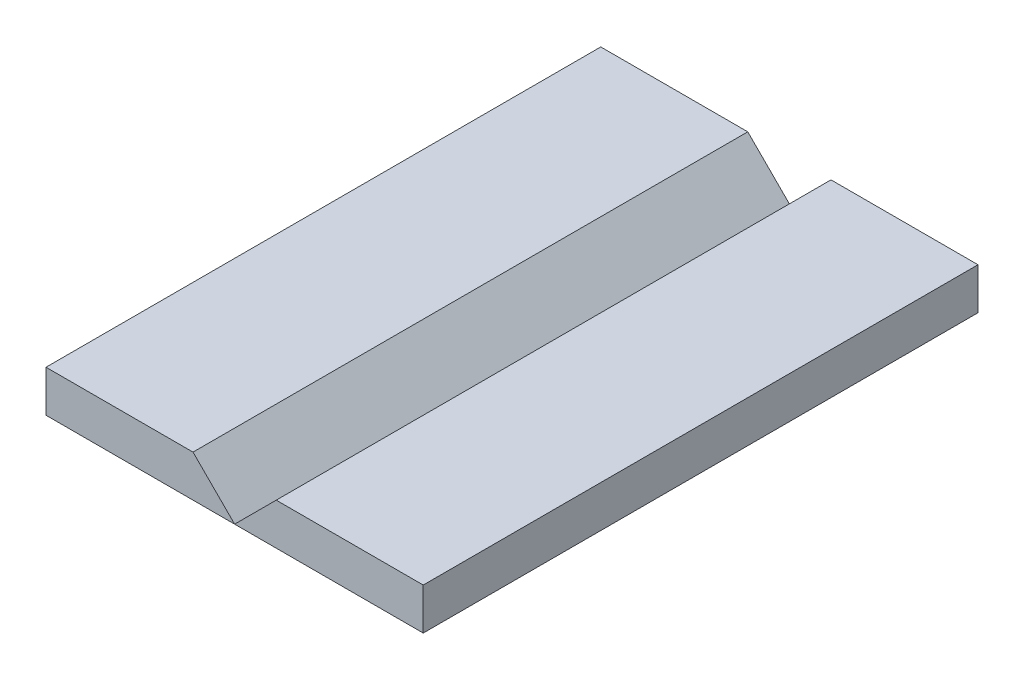
ISO-10303-21;
HEADER;
FILE_DESCRIPTION(('STEP AP214'),'2;1');
FILE_NAME('part.step','',(''),(''),'','','');
FILE_SCHEMA(('AUTOMOTIVE_DESIGN { 1 0 10303 214 1 1 1 1 }'));
ENDSEC;
DATA;
#1=APPLICATION_CONTEXT('core data for automotive mechanical design processes');
#2=APPLICATION_PROTOCOL_DEFINITION('international standard','automotive_design',2000,#1);
#3=PRODUCT_CONTEXT('',#1,'mechanical');
#4=PRODUCT('Part','Part','',(#3));
#5=PRODUCT_RELATED_PRODUCT_CATEGORY('part','',(#4));
#6=PRODUCT_DEFINITION_FORMATION('','',#4);
#7=PRODUCT_DEFINITION_CONTEXT('part definition',#1,'design');
#8=PRODUCT_DEFINITION('design','',#6,#7);
#9=PRODUCT_DEFINITION_SHAPE('','',#8);
#10=(LENGTH_UNIT() NAMED_UNIT(*) SI_UNIT(.MILLI.,.METRE.));
#11=(NAMED_UNIT(*) PLANE_ANGLE_UNIT() SI_UNIT($,.RADIAN.));
#12=(NAMED_UNIT(*) SI_UNIT($,.STERADIAN.) SOLID_ANGLE_UNIT());
#13=UNCERTAINTY_MEASURE_WITH_UNIT(LENGTH_MEASURE(1.E-05),#10,'distance_accuracy_value','');
#14=(GEOMETRIC_REPRESENTATION_CONTEXT(3) GLOBAL_UNCERTAINTY_ASSIGNED_CONTEXT((#13)) GLOBAL_UNIT_ASSIGNED_CONTEXT((#10,
#11,#12)) REPRESENTATION_CONTEXT('',''));
#15=CARTESIAN_POINT('',(0.,0.,0.));
#16=DIRECTION('',(0.,0.,1.));
#17=DIRECTION('',(1.,0.,0.));
#18=AXIS2_PLACEMENT_3D('',#15,#16,#17);
#19=CARTESIAN_POINT('',(34.,-34.,200.));
#20=DIRECTION('',(-0.707106781186548,0.707106781186548,0.));
#21=DIRECTION('',(-0.707106781186548,-0.707106781186548,0.));
#22=AXIS2_PLACEMENT_3D('',#19,#20,#21);
#23=PLANE('',#22);
#24=DIRECTION('',(0.707106781186548,0.707106781186548,0.));
#25=VECTOR('',#24,1.);
#26=CARTESIAN_POINT('',(34.,-34.,0.));
#27=LINE('',#26,#25);
#28=CARTESIAN_POINT('',(68.,0.,0.));
#29=VERTEX_POINT('',#28);
#30=CARTESIAN_POINT('',(83.0000000000004,15.0000000000004,0.));
#31=VERTEX_POINT('',#30);
#32=EDGE_CURVE('E133',#29,#31,#27,.T.);
#33=ORIENTED_EDGE('',*,*,#32,.F.);
#34=DIRECTION('',(0.,0.,-1.));
#35=VECTOR('',#34,1.);
#36=CARTESIAN_POINT('',(68.,0.,200.));
#37=LINE('',#36,#35);
#38=CARTESIAN_POINT('',(68.,0.,200.));
#39=VERTEX_POINT('',#38);
#40=EDGE_CURVE('E13',#39,#29,#37,.T.);
#41=ORIENTED_EDGE('',*,*,#40,.F.);
#42=DIRECTION('',(0.707106781186548,0.707106781186548,0.));
#43=VECTOR('',#42,1.);
#44=CARTESIAN_POINT('',(34.,-34.,200.));
#45=LINE('',#44,#43);
#46=CARTESIAN_POINT('',(83.0000000000004,15.0000000000004,200.));
#47=VERTEX_POINT('',#46);
#48=EDGE_CURVE('E121',#39,#47,#45,.T.);
#49=ORIENTED_EDGE('',*,*,#48,.T.);
#50=DIRECTION('',(0.,0.,-1.));
#51=VECTOR('',#50,1.);
#52=CARTESIAN_POINT('',(83.0000000000004,15.0000000000004,200.));
#53=LINE('',#52,#51);
#54=EDGE_CURVE('E110',#47,#31,#53,.T.);
#55=ORIENTED_EDGE('',*,*,#54,.T.);
#56=EDGE_LOOP('',(#33,#41,#49,#55));
#57=FACE_BOUND('',#56,.T.);
#58=ADVANCED_FACE('F71',(#57),#23,.T.);
#59=CARTESIAN_POINT('',(0.,0.,200.));
#60=DIRECTION('',(0.,1.,0.));
#61=DIRECTION('',(0.,0.,1.));
#62=AXIS2_PLACEMENT_3D('',#59,#60,#61);
#63=PLANE('',#62);
#64=DIRECTION('',(1.,0.,0.));
#65=VECTOR('',#64,1.);
#66=CARTESIAN_POINT('',(0.,0.,0.));
#67=LINE('',#66,#65);
#68=CARTESIAN_POINT('',(136.,0.,0.));
#69=VERTEX_POINT('',#68);
#70=EDGE_CURVE('E126',#29,#69,#67,.T.);
#71=ORIENTED_EDGE('',*,*,#70,.T.);
#72=DIRECTION('',(0.,0.,-1.));
#73=VECTOR('',#72,1.);
#74=CARTESIAN_POINT('',(136.,0.,200.));
#75=LINE('',#74,#73);
#76=CARTESIAN_POINT('',(136.,0.,200.));
#77=VERTEX_POINT('',#76);
#78=EDGE_CURVE('E79',#77,#69,#75,.T.);
#79=ORIENTED_EDGE('',*,*,#78,.F.);
#80=DIRECTION('',(1.,0.,0.));
#81=VECTOR('',#80,1.);
#82=CARTESIAN_POINT('',(0.,0.,200.));
#83=LINE('',#82,#81);
#84=EDGE_CURVE('E116',#39,#77,#83,.T.);
#85=ORIENTED_EDGE('',*,*,#84,.F.);
#86=ORIENTED_EDGE('',*,*,#40,.T.);
#87=EDGE_LOOP('',(#71,#79,#85,#86));
#88=FACE_BOUND('',#87,.T.);
#89=ADVANCED_FACE('F124',(#88),#63,.F.);
#90=CARTESIAN_POINT('',(136.,0.,200.));
#91=DIRECTION('',(-1.,0.,0.));
#92=DIRECTION('',(0.,0.,1.));
#93=AXIS2_PLACEMENT_3D('',#90,#91,#92);
#94=PLANE('',#93);
#95=DIRECTION('',(0.,1.,0.));
#96=VECTOR('',#95,1.);
#97=CARTESIAN_POINT('',(136.,0.,0.));
#98=LINE('',#97,#96);
#99=CARTESIAN_POINT('',(136.,15.0000000000004,0.));
#100=VERTEX_POINT('',#99);
#101=EDGE_CURVE('E103',#69,#100,#98,.T.);
#102=ORIENTED_EDGE('',*,*,#101,.T.);
#103=DIRECTION('',(0.,0.,-1.));
#104=VECTOR('',#103,1.);
#105=CARTESIAN_POINT('',(136.,15.0000000000004,200.));
#106=LINE('',#105,#104);
#107=CARTESIAN_POINT('',(136.,15.0000000000004,200.));
#108=VERTEX_POINT('',#107);
#109=EDGE_CURVE('E127',#108,#100,#106,.T.);
#110=ORIENTED_EDGE('',*,*,#109,.F.);
#111=DIRECTION('',(0.,1.,0.));
#112=VECTOR('',#111,1.);
#113=CARTESIAN_POINT('',(136.,0.,200.));
#114=LINE('',#113,#112);
#115=EDGE_CURVE('E120',#77,#108,#114,.T.);
#116=ORIENTED_EDGE('',*,*,#115,.F.);
#117=ORIENTED_EDGE('',*,*,#78,.T.);
#118=EDGE_LOOP('',(#102,#110,#116,#117));
#119=FACE_BOUND('',#118,.T.);
#120=ADVANCED_FACE('F128',(#119),#94,.F.);
#121=CARTESIAN_POINT('',(0.,15.0000000000004,200.));
#122=DIRECTION('',(0.,-1.,0.));
#123=DIRECTION('',(0.,0.,-1.));
#124=AXIS2_PLACEMENT_3D('',#121,#122,#123);
#125=PLANE('',#124);
#126=DIRECTION('',(-1.,0.,0.));
#127=VECTOR('',#126,1.);
#128=CARTESIAN_POINT('',(0.,15.0000000000004,0.));
#129=LINE('',#128,#127);
#130=EDGE_CURVE('E138',#100,#31,#129,.T.);
#131=ORIENTED_EDGE('',*,*,#130,.T.);
#132=ORIENTED_EDGE('',*,*,#54,.F.);
#133=DIRECTION('',(-1.,0.,0.));
#134=VECTOR('',#133,1.);
#135=CARTESIAN_POINT('',(0.,15.0000000000004,200.));
#136=LINE('',#135,#134);
#137=EDGE_CURVE('E87',#108,#47,#136,.T.);
#138=ORIENTED_EDGE('',*,*,#137,.F.);
#139=ORIENTED_EDGE('',*,*,#109,.T.);
#140=EDGE_LOOP('',(#131,#132,#138,#139));
#141=FACE_BOUND('',#140,.T.);
#142=ADVANCED_FACE('F143',(#141),#125,.F.);
#143=CARTESIAN_POINT('',(0.,0.,200.));
#144=DIRECTION('',(0.,0.,1.));
#145=DIRECTION('',(1.,0.,0.));
#146=AXIS2_PLACEMENT_3D('',#143,#144,#145);
#147=PLANE('',#146);
#148=ORIENTED_EDGE('',*,*,#48,.F.);
#149=ORIENTED_EDGE('',*,*,#84,.T.);
#150=ORIENTED_EDGE('',*,*,#115,.T.);
#151=ORIENTED_EDGE('',*,*,#137,.T.);
#152=EDGE_LOOP('',(#148,#149,#150,#151));
#153=FACE_BOUND('',#152,.T.);
#154=ADVANCED_FACE('F118',(#153),#147,.T.);
#155=CARTESIAN_POINT('',(0.,0.,0.));
#156=DIRECTION('',(0.,0.,1.));
#157=DIRECTION('',(1.,0.,0.));
#158=AXIS2_PLACEMENT_3D('',#155,#156,#157);
#159=PLANE('',#158);
#160=ORIENTED_EDGE('',*,*,#32,.T.);
#161=ORIENTED_EDGE('',*,*,#130,.F.);
#162=ORIENTED_EDGE('',*,*,#101,.F.);
#163=ORIENTED_EDGE('',*,*,#70,.F.);
#164=EDGE_LOOP('',(#160,#161,#162,#163));
#165=FACE_BOUND('',#164,.T.);
#166=ADVANCED_FACE('F145',(#165),#159,.F.);
#167=CLOSED_SHELL('',(#58,#89,#120,#142,#154,#166));
#168=MANIFOLD_SOLID_BREP('B2',#167);
#169=CARTESIAN_POINT('',(0.,0.,200.));
#170=DIRECTION('',(0.,1.,0.));
#171=DIRECTION('',(0.,0.,1.));
#172=AXIS2_PLACEMENT_3D('',#169,#170,#171);
#173=PLANE('',#172);
#174=DIRECTION('',(1.,0.,0.));
#175=VECTOR('',#174,1.);
#176=CARTESIAN_POINT('',(0.,0.,0.));
#177=LINE('',#176,#175);
#178=CARTESIAN_POINT('',(0.,0.,0.));
#179=VERTEX_POINT('',#178);
#180=CARTESIAN_POINT('',(68.,0.,0.));
#181=VERTEX_POINT('',#180);
#182=EDGE_CURVE('E258',#179,#181,#177,.T.);
#183=ORIENTED_EDGE('',*,*,#182,.T.);
#184=DIRECTION('',(0.,0.,-1.));
#185=VECTOR('',#184,1.);
#186=CARTESIAN_POINT('',(68.,0.,200.));
#187=LINE('',#186,#185);
#188=CARTESIAN_POINT('',(68.,0.,200.));
#189=VERTEX_POINT('',#188);
#190=EDGE_CURVE('E69',#189,#181,#187,.T.);
#191=ORIENTED_EDGE('',*,*,#190,.F.);
#192=DIRECTION('',(1.,0.,0.));
#193=VECTOR('',#192,1.);
#194=CARTESIAN_POINT('',(0.,0.,200.));
#195=LINE('',#194,#193);
#196=CARTESIAN_POINT('',(0.,0.,200.));
#197=VERTEX_POINT('',#196);
#198=EDGE_CURVE('E244',#197,#189,#195,.T.);
#199=ORIENTED_EDGE('',*,*,#198,.F.);
#200=DIRECTION('',(0.,0.,-1.));
#201=VECTOR('',#200,1.);
#202=CARTESIAN_POINT('',(0.,0.,200.));
#203=LINE('',#202,#201);
#204=EDGE_CURVE('E211',#197,#179,#203,.T.);
#205=ORIENTED_EDGE('',*,*,#204,.T.);
#206=EDGE_LOOP('',(#183,#191,#199,#205));
#207=FACE_BOUND('',#206,.T.);
#208=ADVANCED_FACE('F195',(#207),#173,.F.);
#209=CARTESIAN_POINT('',(34.,34.,200.));
#210=DIRECTION('',(-0.707106781186548,-0.707106781186548,0.));
#211=DIRECTION('',(0.707106781186548,-0.707106781186548,0.));
#212=AXIS2_PLACEMENT_3D('',#209,#210,#211);
#213=PLANE('',#212);
#214=DIRECTION('',(-0.707106781186548,0.707106781186548,0.));
#215=VECTOR('',#214,1.);
#216=CARTESIAN_POINT('',(34.,34.,0.));
#217=LINE('',#216,#215);
#218=CARTESIAN_POINT('',(52.9999999999996,15.0000000000004,0.));
#219=VERTEX_POINT('',#218);
#220=EDGE_CURVE('E249',#181,#219,#217,.T.);
#221=ORIENTED_EDGE('',*,*,#220,.T.);
#222=DIRECTION('',(0.,0.,-1.));
#223=VECTOR('',#222,1.);
#224=CARTESIAN_POINT('',(52.9999999999996,15.0000000000004,200.));
#225=LINE('',#224,#223);
#226=CARTESIAN_POINT('',(52.9999999999996,15.0000000000004,200.));
#227=VERTEX_POINT('',#226);
#228=EDGE_CURVE('E203',#227,#219,#225,.T.);
#229=ORIENTED_EDGE('',*,*,#228,.F.);
#230=DIRECTION('',(-0.707106781186548,0.707106781186548,0.));
#231=VECTOR('',#230,1.);
#232=CARTESIAN_POINT('',(34.,34.,200.));
#233=LINE('',#232,#231);
#234=EDGE_CURVE('E236',#189,#227,#233,.T.);
#235=ORIENTED_EDGE('',*,*,#234,.F.);
#236=ORIENTED_EDGE('',*,*,#190,.T.);
#237=EDGE_LOOP('',(#221,#229,#235,#236));
#238=FACE_BOUND('',#237,.T.);
#239=ADVANCED_FACE('F248',(#238),#213,.F.);
#240=CARTESIAN_POINT('',(-1.01628611186944E-13,15.,200.));
#241=DIRECTION('',(0.,1.,0.));
#242=DIRECTION('',(-1.,0.,0.));
#243=AXIS2_PLACEMENT_3D('',#240,#241,#242);
#244=PLANE('',#243);
#245=DIRECTION('',(1.,0.,0.));
#246=VECTOR('',#245,1.);
#247=CARTESIAN_POINT('',(-1.01628611186944E-13,15.,0.));
#248=LINE('',#247,#246);
#249=CARTESIAN_POINT('',(0.,15.,0.));
#250=VERTEX_POINT('',#249);
#251=EDGE_CURVE('E261',#250,#219,#248,.T.);
#252=ORIENTED_EDGE('',*,*,#251,.F.);
#253=DIRECTION('',(0.,0.,-1.));
#254=VECTOR('',#253,1.);
#255=CARTESIAN_POINT('',(0.,15.,200.));
#256=LINE('',#255,#254);
#257=CARTESIAN_POINT('',(0.,15.,200.));
#258=VERTEX_POINT('',#257);
#259=EDGE_CURVE('E225',#258,#250,#256,.T.);
#260=ORIENTED_EDGE('',*,*,#259,.F.);
#261=DIRECTION('',(1.,0.,0.));
#262=VECTOR('',#261,1.);
#263=CARTESIAN_POINT('',(-1.01628611186944E-13,15.,200.));
#264=LINE('',#263,#262);
#265=EDGE_CURVE('E243',#258,#227,#264,.T.);
#266=ORIENTED_EDGE('',*,*,#265,.T.);
#267=ORIENTED_EDGE('',*,*,#228,.T.);
#268=EDGE_LOOP('',(#252,#260,#266,#267));
#269=FACE_BOUND('',#268,.T.);
#270=ADVANCED_FACE('F252',(#269),#244,.T.);
#271=CARTESIAN_POINT('',(0.,0.,200.));
#272=DIRECTION('',(-1.,0.,0.));
#273=DIRECTION('',(0.,0.,1.));
#274=AXIS2_PLACEMENT_3D('',#271,#272,#273);
#275=PLANE('',#274);
#276=DIRECTION('',(0.,1.,0.));
#277=VECTOR('',#276,1.);
#278=CARTESIAN_POINT('',(0.,0.,0.));
#279=LINE('',#278,#277);
#280=EDGE_CURVE('E263',#179,#250,#279,.T.);
#281=ORIENTED_EDGE('',*,*,#280,.F.);
#282=ORIENTED_EDGE('',*,*,#204,.F.);
#283=DIRECTION('',(0.,1.,0.));
#284=VECTOR('',#283,1.);
#285=CARTESIAN_POINT('',(0.,0.,200.));
#286=LINE('',#285,#284);
#287=EDGE_CURVE('E253',#197,#258,#286,.T.);
#288=ORIENTED_EDGE('',*,*,#287,.T.);
#289=ORIENTED_EDGE('',*,*,#259,.T.);
#290=EDGE_LOOP('',(#281,#282,#288,#289));
#291=FACE_BOUND('',#290,.T.);
#292=ADVANCED_FACE('F269',(#291),#275,.T.);
#293=CARTESIAN_POINT('',(0.,0.,200.));
#294=DIRECTION('',(0.,0.,1.));
#295=DIRECTION('',(1.,0.,0.));
#296=AXIS2_PLACEMENT_3D('',#293,#294,#295);
#297=PLANE('',#296);
#298=ORIENTED_EDGE('',*,*,#198,.T.);
#299=ORIENTED_EDGE('',*,*,#234,.T.);
#300=ORIENTED_EDGE('',*,*,#265,.F.);
#301=ORIENTED_EDGE('',*,*,#287,.F.);
#302=EDGE_LOOP('',(#298,#299,#300,#301));
#303=FACE_BOUND('',#302,.T.);
#304=ADVANCED_FACE('F240',(#303),#297,.T.);
#305=CARTESIAN_POINT('',(0.,0.,0.));
#306=DIRECTION('',(0.,0.,1.));
#307=DIRECTION('',(1.,0.,0.));
#308=AXIS2_PLACEMENT_3D('',#305,#306,#307);
#309=PLANE('',#308);
#310=ORIENTED_EDGE('',*,*,#182,.F.);
#311=ORIENTED_EDGE('',*,*,#280,.T.);
#312=ORIENTED_EDGE('',*,*,#251,.T.);
#313=ORIENTED_EDGE('',*,*,#220,.F.);
#314=EDGE_LOOP('',(#310,#311,#312,#313));
#315=FACE_BOUND('',#314,.T.);
#316=ADVANCED_FACE('F268',(#315),#309,.F.);
#317=CLOSED_SHELL('',(#208,#239,#270,#292,#304,#316));
#318=MANIFOLD_SOLID_BREP('B7',#317);
#319=ADVANCED_BREP_SHAPE_REPRESENTATION('',(#18,#168,#318),#14);
#320=SHAPE_DEFINITION_REPRESENTATION(#9,#319);
ENDSEC;
END-ISO-10303-21;
